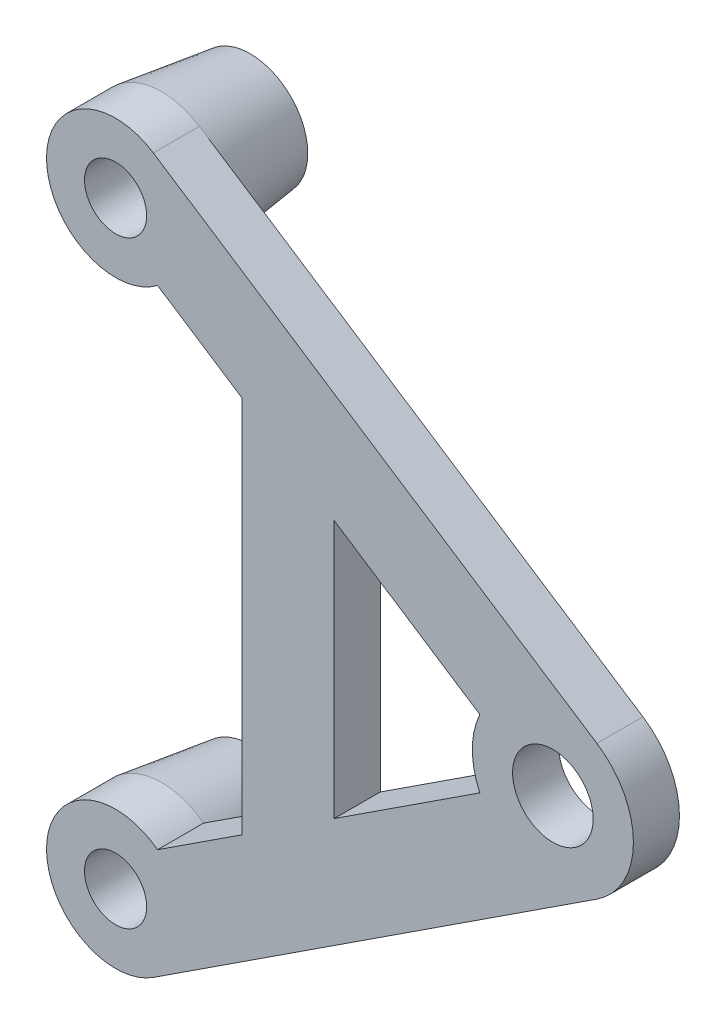
ISO-10303-21;
HEADER;
FILE_DESCRIPTION(('STEP AP214'),'2;1');
FILE_NAME('part.step','',(''),(''),'','','');
FILE_SCHEMA(('AUTOMOTIVE_DESIGN { 1 0 10303 214 1 1 1 1 }'));
ENDSEC;
DATA;
#1=APPLICATION_CONTEXT('core data for automotive mechanical design processes');
#2=APPLICATION_PROTOCOL_DEFINITION('international standard','automotive_design',2000,#1);
#3=PRODUCT_CONTEXT('',#1,'mechanical');
#4=PRODUCT('Part','Part','',(#3));
#5=PRODUCT_RELATED_PRODUCT_CATEGORY('part','',(#4));
#6=PRODUCT_DEFINITION_FORMATION('','',#4);
#7=PRODUCT_DEFINITION_CONTEXT('part definition',#1,'design');
#8=PRODUCT_DEFINITION('design','',#6,#7);
#9=PRODUCT_DEFINITION_SHAPE('','',#8);
#10=(LENGTH_UNIT() NAMED_UNIT(*) SI_UNIT(.MILLI.,.METRE.));
#11=(NAMED_UNIT(*) PLANE_ANGLE_UNIT() SI_UNIT($,.RADIAN.));
#12=(NAMED_UNIT(*) SI_UNIT($,.STERADIAN.) SOLID_ANGLE_UNIT());
#13=UNCERTAINTY_MEASURE_WITH_UNIT(LENGTH_MEASURE(1.E-05),#10,'distance_accuracy_value','');
#14=(GEOMETRIC_REPRESENTATION_CONTEXT(3) GLOBAL_UNCERTAINTY_ASSIGNED_CONTEXT((#13)) GLOBAL_UNIT_ASSIGNED_CONTEXT((#10,
#11,#12)) REPRESENTATION_CONTEXT('',''));
#15=CARTESIAN_POINT('',(0.,0.,0.));
#16=DIRECTION('',(0.,0.,1.));
#17=DIRECTION('',(1.,0.,0.));
#18=AXIS2_PLACEMENT_3D('',#15,#16,#17);
#19=CARTESIAN_POINT('',(0.,0.,0.));
#20=DIRECTION('',(0.,0.,1.));
#21=DIRECTION('',(1.,0.,0.));
#22=AXIS2_PLACEMENT_3D('',#19,#20,#21);
#23=PLANE('',#22);
#24=DIRECTION('',(0.837376741295073,-0.546626191412417,0.));
#25=VECTOR('',#24,1.);
#26=CARTESIAN_POINT('',(5.13057747821047,7.85953237726286,0.));
#27=LINE('',#26,#25);
#28=CARTESIAN_POINT('',(-15.3563342054036,21.2330618236347,7.01695646032618E-13));
#29=VERTEX_POINT('',#28);
#30=CARTESIAN_POINT('',(-8.,16.4309640925255,0.));
#31=VERTEX_POINT('',#30);
#32=EDGE_CURVE('E182',#29,#31,#27,.T.);
#33=ORIENTED_EDGE('',*,*,#32,.F.);
#34=CARTESIAN_POINT('',(-19.,26.,0.));
#35=DIRECTION('',(0.,0.,1.));
#36=DIRECTION('',(1.,0.,0.));
#37=AXIS2_PLACEMENT_3D('',#34,#35,#36);
#38=CIRCLE('',#37,6.);
#39=CARTESIAN_POINT('',(-15.7202428515256,31.0242604477705,0.));
#40=VERTEX_POINT('',#39);
#41=EDGE_CURVE('E41',#29,#40,#38,.T.);
#42=ORIENTED_EDGE('',*,*,#41,.T.);
#43=DIRECTION('',(0.837376741295073,-0.546626191412416,0.));
#44=VECTOR('',#43,1.);
#45=CARTESIAN_POINT('',(9.50358700950979,14.5585463076234,0.));
#46=LINE('',#45,#44);
#47=CARTESIAN_POINT('',(22.826383339887,5.86163718906552,0.));
#48=VERTEX_POINT('',#47);
#49=EDGE_CURVE('E228',#40,#48,#46,.T.);
#50=ORIENTED_EDGE('',*,*,#49,.T.);
#51=CARTESIAN_POINT('',(19.,0.,0.));
#52=DIRECTION('',(0.,0.,1.));
#53=DIRECTION('',(1.,0.,0.));
#54=AXIS2_PLACEMENT_3D('',#51,#52,#53);
#55=CIRCLE('',#54,7.00000000000007);
#56=CARTESIAN_POINT('',(22.826383339887,-5.86163718906551,0.));
#57=VERTEX_POINT('',#56);
#58=EDGE_CURVE('E225',#57,#48,#55,.T.);
#59=ORIENTED_EDGE('',*,*,#58,.F.);
#60=DIRECTION('',(0.837376741295073,0.546626191412416,0.));
#61=VECTOR('',#60,1.);
#62=CARTESIAN_POINT('',(9.50358700950978,-14.5585463076234,0.));
#63=LINE('',#62,#61);
#64=CARTESIAN_POINT('',(-15.7202428515255,-31.0242604477705,0.));
#65=VERTEX_POINT('',#64);
#66=EDGE_CURVE('E223',#65,#57,#63,.T.);
#67=ORIENTED_EDGE('',*,*,#66,.F.);
#68=CARTESIAN_POINT('',(-19.,-26.,0.));
#69=DIRECTION('',(0.,0.,1.));
#70=DIRECTION('',(1.,0.,0.));
#71=AXIS2_PLACEMENT_3D('',#68,#69,#70);
#72=CIRCLE('',#71,6.);
#73=CARTESIAN_POINT('',(-15.3563342054037,-21.2330618236347,0.));
#74=VERTEX_POINT('',#73);
#75=EDGE_CURVE('E11',#74,#65,#72,.F.);
#76=ORIENTED_EDGE('',*,*,#75,.F.);
#77=DIRECTION('',(-0.837376741295072,-0.546626191412418,0.));
#78=VECTOR('',#77,1.);
#79=CARTESIAN_POINT('',(5.13057747821048,-7.85953237726286,0.));
#80=LINE('',#79,#78);
#81=CARTESIAN_POINT('',(-7.99999999999999,-16.4309640925255,0.));
#82=VERTEX_POINT('',#81);
#83=EDGE_CURVE('E173',#82,#74,#80,.T.);
#84=ORIENTED_EDGE('',*,*,#83,.F.);
#85=DIRECTION('',(0.,-1.,0.));
#86=VECTOR('',#85,1.);
#87=CARTESIAN_POINT('',(-8.,0.,0.));
#88=LINE('',#87,#86);
#89=EDGE_CURVE('E184',#31,#82,#88,.T.);
#90=ORIENTED_EDGE('',*,*,#89,.F.);
#91=EDGE_LOOP('',(#33,#42,#50,#59,#67,#76,#84,#90));
#92=FACE_BOUND('',#91,.T.);
#93=CARTESIAN_POINT('',(19.,0.,0.));
#94=DIRECTION('',(0.,0.,1.));
#95=DIRECTION('',(1.,0.,0.));
#96=AXIS2_PLACEMENT_3D('',#93,#94,#95);
#97=CIRCLE('',#96,3.5);
#98=CARTESIAN_POINT('',(22.5,0.,0.));
#99=VERTEX_POINT('',#98);
#100=EDGE_CURVE('E202',#99,#99,#97,.T.);
#101=ORIENTED_EDGE('',*,*,#100,.T.);
#102=EDGE_LOOP('',(#101));
#103=FACE_BOUND('',#102,.T.);
#104=CARTESIAN_POINT('',(19.,0.,0.));
#105=DIRECTION('',(0.,0.,1.));
#106=DIRECTION('',(1.,0.,0.));
#107=AXIS2_PLACEMENT_3D('',#104,#105,#106);
#108=CIRCLE('',#107,7.00000000000007);
#109=CARTESIAN_POINT('',(12.6518575645895,2.94976060380174,0.));
#110=VERTEX_POINT('',#109);
#111=CARTESIAN_POINT('',(12.6518575645895,-2.94976060380173,0.));
#112=VERTEX_POINT('',#111);
#113=EDGE_CURVE('E158',#110,#112,#108,.T.);
#114=ORIENTED_EDGE('',*,*,#113,.F.);
#115=DIRECTION('',(0.837376741295073,-0.546626191412417,0.));
#116=VECTOR('',#115,1.);
#117=CARTESIAN_POINT('',(5.13057747821047,7.85953237726286,0.));
#118=LINE('',#117,#116);
#119=CARTESIAN_POINT('',(0.,11.2086915888301,0.));
#120=VERTEX_POINT('',#119);
#121=EDGE_CURVE('E151',#120,#110,#118,.T.);
#122=ORIENTED_EDGE('',*,*,#121,.F.);
#123=DIRECTION('',(0.,1.,0.));
#124=VECTOR('',#123,1.);
#125=CARTESIAN_POINT('',(0.,0.,0.));
#126=LINE('',#125,#124);
#127=CARTESIAN_POINT('',(0.,-11.2086915888301,0.));
#128=VERTEX_POINT('',#127);
#129=EDGE_CURVE('E132',#128,#120,#126,.T.);
#130=ORIENTED_EDGE('',*,*,#129,.F.);
#131=DIRECTION('',(-0.837376741295072,-0.546626191412418,0.));
#132=VECTOR('',#131,1.);
#133=CARTESIAN_POINT('',(5.13057747821048,-7.85953237726286,0.));
#134=LINE('',#133,#132);
#135=EDGE_CURVE('E156',#112,#128,#134,.T.);
#136=ORIENTED_EDGE('',*,*,#135,.F.);
#137=EDGE_LOOP('',(#114,#122,#130,#136));
#138=FACE_BOUND('',#137,.T.);
#139=ADVANCED_FACE('F37',(#92,#103,#138),#23,.F.);
#140=CARTESIAN_POINT('',(0.,0.,4.));
#141=DIRECTION('',(0.,0.,1.));
#142=DIRECTION('',(1.,0.,0.));
#143=AXIS2_PLACEMENT_3D('',#140,#141,#142);
#144=PLANE('',#143);
#145=DIRECTION('',(-0.837376741295073,-0.546626191412418,0.));
#146=VECTOR('',#145,1.);
#147=CARTESIAN_POINT('',(5.13057747821048,-7.85953237726286,4.));
#148=LINE('',#147,#146);
#149=CARTESIAN_POINT('',(-7.99999999999999,-16.4309640925255,4.));
#150=VERTEX_POINT('',#149);
#151=CARTESIAN_POINT('',(-15.3563342054036,-21.2330618236347,4.));
#152=VERTEX_POINT('',#151);
#153=EDGE_CURVE('E160',#150,#152,#148,.T.);
#154=ORIENTED_EDGE('',*,*,#153,.T.);
#155=CARTESIAN_POINT('',(-19.,-26.,4.));
#156=DIRECTION('',(0.,0.,1.));
#157=DIRECTION('',(1.,0.,0.));
#158=AXIS2_PLACEMENT_3D('',#155,#156,#157);
#159=CIRCLE('',#158,6.);
#160=CARTESIAN_POINT('',(-15.7202428515256,-31.0242604477705,4.));
#161=VERTEX_POINT('',#160);
#162=EDGE_CURVE('E199',#152,#161,#159,.T.);
#163=ORIENTED_EDGE('',*,*,#162,.T.);
#164=DIRECTION('',(0.837376741295073,0.546626191412416,0.));
#165=VECTOR('',#164,1.);
#166=CARTESIAN_POINT('',(9.50358700950978,-14.5585463076234,4.));
#167=LINE('',#166,#165);
#168=CARTESIAN_POINT('',(22.826383339887,-5.86163718906551,4.));
#169=VERTEX_POINT('',#168);
#170=EDGE_CURVE('E201',#161,#169,#167,.T.);
#171=ORIENTED_EDGE('',*,*,#170,.T.);
#172=CARTESIAN_POINT('',(19.,0.,4.));
#173=DIRECTION('',(0.,0.,1.));
#174=DIRECTION('',(1.,0.,0.));
#175=AXIS2_PLACEMENT_3D('',#172,#173,#174);
#176=CIRCLE('',#175,7.00000000000007);
#177=CARTESIAN_POINT('',(22.826383339887,5.86163718906552,4.));
#178=VERTEX_POINT('',#177);
#179=EDGE_CURVE('E204',#169,#178,#176,.T.);
#180=ORIENTED_EDGE('',*,*,#179,.T.);
#181=DIRECTION('',(0.837376741295073,-0.546626191412416,0.));
#182=VECTOR('',#181,1.);
#183=CARTESIAN_POINT('',(9.50358700950979,14.5585463076234,4.));
#184=LINE('',#183,#182);
#185=CARTESIAN_POINT('',(-15.7202428515256,31.0242604477705,4.));
#186=VERTEX_POINT('',#185);
#187=EDGE_CURVE('E206',#186,#178,#184,.T.);
#188=ORIENTED_EDGE('',*,*,#187,.F.);
#189=CARTESIAN_POINT('',(-19.,26.,4.));
#190=DIRECTION('',(0.,0.,1.));
#191=DIRECTION('',(1.,0.,0.));
#192=AXIS2_PLACEMENT_3D('',#189,#190,#191);
#193=CIRCLE('',#192,6.00000000000006);
#194=CARTESIAN_POINT('',(-15.3563342054036,21.2330618236347,4.));
#195=VERTEX_POINT('',#194);
#196=EDGE_CURVE('E209',#186,#195,#193,.T.);
#197=ORIENTED_EDGE('',*,*,#196,.T.);
#198=DIRECTION('',(0.837376741295073,-0.546626191412417,0.));
#199=VECTOR('',#198,1.);
#200=CARTESIAN_POINT('',(5.13057747821047,7.85953237726286,4.));
#201=LINE('',#200,#199);
#202=CARTESIAN_POINT('',(-8.,16.4309640925255,4.));
#203=VERTEX_POINT('',#202);
#204=EDGE_CURVE('E166',#195,#203,#201,.T.);
#205=ORIENTED_EDGE('',*,*,#204,.T.);
#206=DIRECTION('',(0.,-1.,0.));
#207=VECTOR('',#206,1.);
#208=CARTESIAN_POINT('',(-8.,0.,4.));
#209=LINE('',#208,#207);
#210=EDGE_CURVE('E163',#203,#150,#209,.T.);
#211=ORIENTED_EDGE('',*,*,#210,.T.);
#212=EDGE_LOOP('',(#154,#163,#171,#180,#188,#197,#205,#211));
#213=FACE_BOUND('',#212,.T.);
#214=CARTESIAN_POINT('',(19.,0.,4.));
#215=DIRECTION('',(0.,0.,1.));
#216=DIRECTION('',(1.,0.,0.));
#217=AXIS2_PLACEMENT_3D('',#214,#215,#216);
#218=CIRCLE('',#217,3.5);
#219=CARTESIAN_POINT('',(22.5,0.,4.));
#220=VERTEX_POINT('',#219);
#221=EDGE_CURVE('E211',#220,#220,#218,.T.);
#222=ORIENTED_EDGE('',*,*,#221,.F.);
#223=EDGE_LOOP('',(#222));
#224=FACE_BOUND('',#223,.T.);
#225=CARTESIAN_POINT('',(-19.,26.,4.));
#226=DIRECTION('',(0.,0.,1.));
#227=DIRECTION('',(1.,0.,0.));
#228=AXIS2_PLACEMENT_3D('',#225,#226,#227);
#229=CIRCLE('',#228,2.7);
#230=CARTESIAN_POINT('',(-16.3,26.,4.));
#231=VERTEX_POINT('',#230);
#232=EDGE_CURVE('E214',#231,#231,#229,.T.);
#233=ORIENTED_EDGE('',*,*,#232,.F.);
#234=EDGE_LOOP('',(#233));
#235=FACE_BOUND('',#234,.T.);
#236=CARTESIAN_POINT('',(-19.,-26.,4.));
#237=DIRECTION('',(0.,0.,1.));
#238=DIRECTION('',(1.,0.,0.));
#239=AXIS2_PLACEMENT_3D('',#236,#237,#238);
#240=CIRCLE('',#239,2.7);
#241=CARTESIAN_POINT('',(-16.3,-26.,4.));
#242=VERTEX_POINT('',#241);
#243=EDGE_CURVE('E217',#242,#242,#240,.T.);
#244=ORIENTED_EDGE('',*,*,#243,.F.);
#245=EDGE_LOOP('',(#244));
#246=FACE_BOUND('',#245,.T.);
#247=DIRECTION('',(0.837376741295073,-0.546626191412417,0.));
#248=VECTOR('',#247,1.);
#249=CARTESIAN_POINT('',(5.13057747821047,7.85953237726286,4.));
#250=LINE('',#249,#248);
#251=CARTESIAN_POINT('',(0.,11.2086915888301,4.));
#252=VERTEX_POINT('',#251);
#253=CARTESIAN_POINT('',(12.6518575645895,2.94976060380174,4.));
#254=VERTEX_POINT('',#253);
#255=EDGE_CURVE('E138',#252,#254,#250,.T.);
#256=ORIENTED_EDGE('',*,*,#255,.T.);
#257=CARTESIAN_POINT('',(19.,0.,4.));
#258=DIRECTION('',(0.,0.,1.));
#259=DIRECTION('',(1.,0.,0.));
#260=AXIS2_PLACEMENT_3D('',#257,#258,#259);
#261=CIRCLE('',#260,7.00000000000007);
#262=CARTESIAN_POINT('',(12.6518575645895,-2.94976060380173,4.));
#263=VERTEX_POINT('',#262);
#264=EDGE_CURVE('E61',#254,#263,#261,.T.);
#265=ORIENTED_EDGE('',*,*,#264,.T.);
#266=DIRECTION('',(-0.837376741295073,-0.546626191412418,0.));
#267=VECTOR('',#266,1.);
#268=CARTESIAN_POINT('',(5.13057747821048,-7.85953237726286,4.));
#269=LINE('',#268,#267);
#270=CARTESIAN_POINT('',(0.,-11.2086915888301,4.));
#271=VERTEX_POINT('',#270);
#272=EDGE_CURVE('E144',#263,#271,#269,.T.);
#273=ORIENTED_EDGE('',*,*,#272,.T.);
#274=DIRECTION('',(0.,1.,0.));
#275=VECTOR('',#274,1.);
#276=CARTESIAN_POINT('',(0.,0.,4.));
#277=LINE('',#276,#275);
#278=EDGE_CURVE('E129',#271,#252,#277,.T.);
#279=ORIENTED_EDGE('',*,*,#278,.T.);
#280=EDGE_LOOP('',(#256,#265,#273,#279));
#281=FACE_BOUND('',#280,.T.);
#282=ADVANCED_FACE('F142',(#213,#224,#235,#246,#281),#144,.T.);
#283=CARTESIAN_POINT('',(-19.,-26.,4.));
#284=DIRECTION('',(0.,0.,-1.));
#285=DIRECTION('',(-1.,0.,0.));
#286=AXIS2_PLACEMENT_3D('',#283,#284,#285);
#287=CYLINDRICAL_SURFACE('',#286,6.);
#288=CARTESIAN_POINT('',(-19.,-26.,0.));
#289=DIRECTION('',(0.,0.,1.));
#290=DIRECTION('',(1.,0.,0.));
#291=AXIS2_PLACEMENT_3D('',#288,#289,#290);
#292=CIRCLE('',#291,6.);
#293=EDGE_CURVE('E198',#74,#65,#292,.T.);
#294=ORIENTED_EDGE('',*,*,#293,.T.);
#295=DIRECTION('',(0.,0.,-1.));
#296=VECTOR('',#295,1.);
#297=CARTESIAN_POINT('',(-15.7202428515256,-31.0242604477705,4.));
#298=LINE('',#297,#296);
#299=EDGE_CURVE('E237',#161,#65,#298,.T.);
#300=ORIENTED_EDGE('',*,*,#299,.F.);
#301=ORIENTED_EDGE('',*,*,#162,.F.);
#302=DIRECTION('',(0.,0.,1.));
#303=VECTOR('',#302,1.);
#304=CARTESIAN_POINT('',(-15.3563342054036,-21.2330618236347,-7.70000000000004));
#305=LINE('',#304,#303);
#306=EDGE_CURVE('E169',#74,#152,#305,.T.);
#307=ORIENTED_EDGE('',*,*,#306,.F.);
#308=EDGE_LOOP('',(#294,#300,#301,#307));
#309=FACE_BOUND('',#308,.T.);
#310=ADVANCED_FACE('F39',(#309),#287,.T.);
#311=CARTESIAN_POINT('',(9.50358700950978,-14.5585463076234,4.));
#312=DIRECTION('',(-0.546626191412416,0.837376741295073,0.));
#313=DIRECTION('',(-0.837376741295073,-0.546626191412416,0.));
#314=AXIS2_PLACEMENT_3D('',#311,#312,#313);
#315=PLANE('',#314);
#316=ORIENTED_EDGE('',*,*,#66,.T.);
#317=DIRECTION('',(0.,0.,-1.));
#318=VECTOR('',#317,1.);
#319=CARTESIAN_POINT('',(22.826383339887,-5.86163718906551,4.));
#320=LINE('',#319,#318);
#321=EDGE_CURVE('E234',#169,#57,#320,.T.);
#322=ORIENTED_EDGE('',*,*,#321,.F.);
#323=ORIENTED_EDGE('',*,*,#170,.F.);
#324=ORIENTED_EDGE('',*,*,#299,.T.);
#325=EDGE_LOOP('',(#316,#322,#323,#324));
#326=FACE_BOUND('',#325,.T.);
#327=ADVANCED_FACE('F270',(#326),#315,.F.);
#328=CARTESIAN_POINT('',(19.,0.,4.));
#329=DIRECTION('',(0.,0.,-1.));
#330=DIRECTION('',(-1.,0.,0.));
#331=AXIS2_PLACEMENT_3D('',#328,#329,#330);
#332=CYLINDRICAL_SURFACE('',#331,7.00000000000007);
#333=ORIENTED_EDGE('',*,*,#58,.T.);
#334=DIRECTION('',(0.,0.,-1.));
#335=VECTOR('',#334,1.);
#336=CARTESIAN_POINT('',(22.826383339887,5.86163718906552,4.));
#337=LINE('',#336,#335);
#338=EDGE_CURVE('E232',#178,#48,#337,.T.);
#339=ORIENTED_EDGE('',*,*,#338,.F.);
#340=ORIENTED_EDGE('',*,*,#179,.F.);
#341=ORIENTED_EDGE('',*,*,#321,.T.);
#342=EDGE_LOOP('',(#333,#339,#340,#341));
#343=FACE_BOUND('',#342,.T.);
#344=ADVANCED_FACE('F266',(#343),#332,.T.);
#345=CARTESIAN_POINT('',(9.50358700950979,14.5585463076234,4.));
#346=DIRECTION('',(0.546626191412416,0.837376741295074,0.));
#347=DIRECTION('',(-0.837376741295073,0.546626191412416,0.));
#348=AXIS2_PLACEMENT_3D('',#345,#346,#347);
#349=PLANE('',#348);
#350=ORIENTED_EDGE('',*,*,#49,.F.);
#351=DIRECTION('',(0.,0.,-1.));
#352=VECTOR('',#351,1.);
#353=CARTESIAN_POINT('',(-15.7202428515256,31.0242604477705,4.));
#354=LINE('',#353,#352);
#355=EDGE_CURVE('E220',#186,#40,#354,.T.);
#356=ORIENTED_EDGE('',*,*,#355,.F.);
#357=ORIENTED_EDGE('',*,*,#187,.T.);
#358=ORIENTED_EDGE('',*,*,#338,.T.);
#359=EDGE_LOOP('',(#350,#356,#357,#358));
#360=FACE_BOUND('',#359,.T.);
#361=ADVANCED_FACE('F260',(#360),#349,.T.);
#362=CARTESIAN_POINT('',(-19.,26.,4.));
#363=DIRECTION('',(0.,0.,-1.));
#364=DIRECTION('',(-1.,0.,0.));
#365=AXIS2_PLACEMENT_3D('',#362,#363,#364);
#366=CYLINDRICAL_SURFACE('',#365,6.00000000000006);
#367=CARTESIAN_POINT('',(-19.,26.,0.));
#368=DIRECTION('',(0.,0.,1.));
#369=DIRECTION('',(1.,0.,0.));
#370=AXIS2_PLACEMENT_3D('',#367,#368,#369);
#371=CIRCLE('',#370,6.00000000000006);
#372=EDGE_CURVE('E231',#40,#29,#371,.T.);
#373=ORIENTED_EDGE('',*,*,#372,.T.);
#374=DIRECTION('',(0.,0.,1.));
#375=VECTOR('',#374,1.);
#376=CARTESIAN_POINT('',(-15.3563342054036,21.2330618236347,-7.70000000000004));
#377=LINE('',#376,#375);
#378=EDGE_CURVE('E170',#29,#195,#377,.T.);
#379=ORIENTED_EDGE('',*,*,#378,.T.);
#380=ORIENTED_EDGE('',*,*,#196,.F.);
#381=ORIENTED_EDGE('',*,*,#355,.T.);
#382=EDGE_LOOP('',(#373,#379,#380,#381));
#383=FACE_BOUND('',#382,.T.);
#384=ADVANCED_FACE('F294',(#383),#366,.T.);
#385=CARTESIAN_POINT('',(-19.,26.,4.));
#386=DIRECTION('',(0.,0.,-1.));
#387=DIRECTION('',(-1.,0.,0.));
#388=AXIS2_PLACEMENT_3D('',#385,#386,#387);
#389=CYLINDRICAL_SURFACE('',#388,2.7);
#390=ORIENTED_EDGE('',*,*,#232,.T.);
#391=EDGE_LOOP('',(#390));
#392=FACE_BOUND('',#391,.T.);
#393=CARTESIAN_POINT('',(-19.,26.,-7.70000000000004));
#394=DIRECTION('',(0.,0.,1.));
#395=DIRECTION('',(1.,0.,0.));
#396=AXIS2_PLACEMENT_3D('',#393,#394,#395);
#397=CIRCLE('',#396,2.7);
#398=CARTESIAN_POINT('',(-16.3,26.,-7.70000000000004));
#399=VERTEX_POINT('',#398);
#400=EDGE_CURVE('E195',#399,#399,#397,.T.);
#401=ORIENTED_EDGE('',*,*,#400,.F.);
#402=EDGE_LOOP('',(#401));
#403=FACE_BOUND('',#402,.T.);
#404=ADVANCED_FACE('F323',(#392,#403),#389,.F.);
#405=CARTESIAN_POINT('',(19.,0.,4.));
#406=DIRECTION('',(0.,0.,-1.));
#407=DIRECTION('',(-1.,0.,0.));
#408=AXIS2_PLACEMENT_3D('',#405,#406,#407);
#409=CYLINDRICAL_SURFACE('',#408,3.5);
#410=ORIENTED_EDGE('',*,*,#221,.T.);
#411=EDGE_LOOP('',(#410));
#412=FACE_BOUND('',#411,.T.);
#413=ORIENTED_EDGE('',*,*,#100,.F.);
#414=EDGE_LOOP('',(#413));
#415=FACE_BOUND('',#414,.T.);
#416=ADVANCED_FACE('F321',(#412,#415),#409,.F.);
#417=CARTESIAN_POINT('',(-19.,-26.,4.));
#418=DIRECTION('',(0.,0.,-1.));
#419=DIRECTION('',(-1.,0.,0.));
#420=AXIS2_PLACEMENT_3D('',#417,#418,#419);
#421=CYLINDRICAL_SURFACE('',#420,2.7);
#422=ORIENTED_EDGE('',*,*,#243,.T.);
#423=EDGE_LOOP('',(#422));
#424=FACE_BOUND('',#423,.T.);
#425=CARTESIAN_POINT('',(-19.,-26.,-7.70000000000004));
#426=DIRECTION('',(0.,0.,-1.));
#427=DIRECTION('',(1.,0.,0.));
#428=AXIS2_PLACEMENT_3D('',#425,#426,#427);
#429=CIRCLE('',#428,2.7);
#430=CARTESIAN_POINT('',(-16.3,-26.,-7.70000000000004));
#431=VERTEX_POINT('',#430);
#432=EDGE_CURVE('E189',#431,#431,#429,.T.);
#433=ORIENTED_EDGE('',*,*,#432,.T.);
#434=EDGE_LOOP('',(#433));
#435=FACE_BOUND('',#434,.T.);
#436=ADVANCED_FACE('F317',(#424,#435),#421,.F.);
#437=CARTESIAN_POINT('',(-17.5241092831865,28.2609172014967,-7.70000000000002));
#438=DIRECTION('',(0.,0.,1.));
#439=DIRECTION('',(1.,0.,0.));
#440=AXIS2_PLACEMENT_3D('',#437,#438,#439);
#441=PLANE('',#440);
#442=CARTESIAN_POINT('',(-19.,26.,-7.70000000000004));
#443=DIRECTION('',(0.,0.,1.));
#444=DIRECTION('',(1.,0.,0.));
#445=AXIS2_PLACEMENT_3D('',#442,#443,#444);
#446=CIRCLE('',#445,5.);
#447=CARTESIAN_POINT('',(-14.,26.,-7.70000000000004));
#448=VERTEX_POINT('',#447);
#449=EDGE_CURVE('E192',#448,#448,#446,.T.);
#450=ORIENTED_EDGE('',*,*,#449,.F.);
#451=EDGE_LOOP('',(#450));
#452=FACE_BOUND('',#451,.T.);
#453=ORIENTED_EDGE('',*,*,#400,.T.);
#454=EDGE_LOOP('',(#453));
#455=FACE_BOUND('',#454,.T.);
#456=ADVANCED_FACE('F320',(#452,#455),#441,.F.);
#457=CARTESIAN_POINT('',(-19.,26.,-7.70000000000004));
#458=DIRECTION('',(0.,0.,1.));
#459=DIRECTION('',(1.,0.,0.));
#460=AXIS2_PLACEMENT_3D('',#457,#458,#459);
#461=CONICAL_SURFACE('',#460,5.,0.12914729012802);
#462=ORIENTED_EDGE('',*,*,#372,.F.);
#463=ORIENTED_EDGE('',*,*,#41,.F.);
#464=EDGE_LOOP('',(#462,#463));
#465=FACE_BOUND('',#464,.T.);
#466=ORIENTED_EDGE('',*,*,#449,.T.);
#467=EDGE_LOOP('',(#466));
#468=FACE_BOUND('',#467,.T.);
#469=ADVANCED_FACE('F291',(#465,#468),#461,.T.);
#470=CARTESIAN_POINT('',(-17.5241092831865,-28.2609172014967,-7.70000000000002));
#471=DIRECTION('',(0.,0.,1.));
#472=DIRECTION('',(1.,0.,0.));
#473=AXIS2_PLACEMENT_3D('',#470,#471,#472);
#474=PLANE('',#473);
#475=CARTESIAN_POINT('',(-19.,-26.,-7.70000000000004));
#476=DIRECTION('',(0.,0.,-1.));
#477=DIRECTION('',(1.,0.,0.));
#478=AXIS2_PLACEMENT_3D('',#475,#476,#477);
#479=CIRCLE('',#478,5.);
#480=CARTESIAN_POINT('',(-14.,-26.,-7.70000000000004));
#481=VERTEX_POINT('',#480);
#482=EDGE_CURVE('E186',#481,#481,#479,.T.);
#483=ORIENTED_EDGE('',*,*,#482,.T.);
#484=EDGE_LOOP('',(#483));
#485=FACE_BOUND('',#484,.T.);
#486=ORIENTED_EDGE('',*,*,#432,.F.);
#487=EDGE_LOOP('',(#486));
#488=FACE_BOUND('',#487,.T.);
#489=ADVANCED_FACE('F358',(#485,#488),#474,.F.);
#490=CARTESIAN_POINT('',(-19.,-26.,-7.70000000000004));
#491=DIRECTION('',(0.,0.,1.));
#492=DIRECTION('',(1.,0.,0.));
#493=AXIS2_PLACEMENT_3D('',#490,#491,#492);
#494=CONICAL_SURFACE('',#493,5.,0.12914729012802);
#495=ORIENTED_EDGE('',*,*,#293,.F.);
#496=ORIENTED_EDGE('',*,*,#75,.T.);
#497=EDGE_LOOP('',(#495,#496));
#498=FACE_BOUND('',#497,.T.);
#499=ORIENTED_EDGE('',*,*,#482,.F.);
#500=EDGE_LOOP('',(#499));
#501=FACE_BOUND('',#500,.T.);
#502=ADVANCED_FACE('F276',(#498,#501),#494,.T.);
#503=CARTESIAN_POINT('',(-8.,0.,-7.70000000000004));
#504=DIRECTION('',(-1.,0.,0.));
#505=DIRECTION('',(0.,-1.,0.));
#506=AXIS2_PLACEMENT_3D('',#503,#504,#505);
#507=PLANE('',#506);
#508=ORIENTED_EDGE('',*,*,#89,.T.);
#509=DIRECTION('',(0.,0.,1.));
#510=VECTOR('',#509,1.);
#511=CARTESIAN_POINT('',(-7.99999999999999,-16.4309640925255,-7.70000000000004));
#512=LINE('',#511,#510);
#513=EDGE_CURVE('E176',#82,#150,#512,.T.);
#514=ORIENTED_EDGE('',*,*,#513,.T.);
#515=ORIENTED_EDGE('',*,*,#210,.F.);
#516=DIRECTION('',(0.,0.,1.));
#517=VECTOR('',#516,1.);
#518=CARTESIAN_POINT('',(-8.,16.4309640925255,-7.70000000000004));
#519=LINE('',#518,#517);
#520=EDGE_CURVE('E174',#31,#203,#519,.T.);
#521=ORIENTED_EDGE('',*,*,#520,.F.);
#522=EDGE_LOOP('',(#508,#514,#515,#521));
#523=FACE_BOUND('',#522,.T.);
#524=ADVANCED_FACE('F286',(#523),#507,.T.);
#525=CARTESIAN_POINT('',(5.13057747821047,7.85953237726286,-7.70000000000004));
#526=DIRECTION('',(-0.546626191412417,-0.837376741295073,0.));
#527=DIRECTION('',(0.837376741295073,-0.546626191412417,0.));
#528=AXIS2_PLACEMENT_3D('',#525,#526,#527);
#529=PLANE('',#528);
#530=ORIENTED_EDGE('',*,*,#32,.T.);
#531=ORIENTED_EDGE('',*,*,#520,.T.);
#532=ORIENTED_EDGE('',*,*,#204,.F.);
#533=ORIENTED_EDGE('',*,*,#378,.F.);
#534=EDGE_LOOP('',(#530,#531,#532,#533));
#535=FACE_BOUND('',#534,.T.);
#536=ADVANCED_FACE('F298',(#535),#529,.T.);
#537=CARTESIAN_POINT('',(5.13057747821048,-7.85953237726286,-7.70000000000004));
#538=DIRECTION('',(-0.546626191412418,0.837376741295072,0.));
#539=DIRECTION('',(-0.837376741295072,-0.546626191412418,0.));
#540=AXIS2_PLACEMENT_3D('',#537,#538,#539);
#541=PLANE('',#540);
#542=ORIENTED_EDGE('',*,*,#83,.T.);
#543=ORIENTED_EDGE('',*,*,#306,.T.);
#544=ORIENTED_EDGE('',*,*,#153,.F.);
#545=ORIENTED_EDGE('',*,*,#513,.F.);
#546=EDGE_LOOP('',(#542,#543,#544,#545));
#547=FACE_BOUND('',#546,.T.);
#548=ADVANCED_FACE('F283',(#547),#541,.T.);
#549=CARTESIAN_POINT('',(19.,0.,-7.70000000000004));
#550=DIRECTION('',(0.,0.,1.));
#551=DIRECTION('',(1.,0.,0.));
#552=AXIS2_PLACEMENT_3D('',#549,#550,#551);
#553=CYLINDRICAL_SURFACE('',#552,7.00000000000007);
#554=ORIENTED_EDGE('',*,*,#113,.T.);
#555=DIRECTION('',(0.,0.,1.));
#556=VECTOR('',#555,1.);
#557=CARTESIAN_POINT('',(12.6518575645895,-2.94976060380173,-7.70000000000004));
#558=LINE('',#557,#556);
#559=EDGE_CURVE('E149',#112,#263,#558,.T.);
#560=ORIENTED_EDGE('',*,*,#559,.T.);
#561=ORIENTED_EDGE('',*,*,#264,.F.);
#562=DIRECTION('',(0.,0.,1.));
#563=VECTOR('',#562,1.);
#564=CARTESIAN_POINT('',(12.6518575645895,2.94976060380174,-7.70000000000004));
#565=LINE('',#564,#563);
#566=EDGE_CURVE('E135',#110,#254,#565,.T.);
#567=ORIENTED_EDGE('',*,*,#566,.F.);
#568=EDGE_LOOP('',(#554,#560,#561,#567));
#569=FACE_BOUND('',#568,.T.);
#570=ADVANCED_FACE('F305',(#569),#553,.T.);
#571=CARTESIAN_POINT('',(5.13057747821048,-7.85953237726286,-7.70000000000004));
#572=DIRECTION('',(-0.546626191412418,0.837376741295072,0.));
#573=DIRECTION('',(-0.837376741295072,-0.546626191412418,0.));
#574=AXIS2_PLACEMENT_3D('',#571,#572,#573);
#575=PLANE('',#574);
#576=ORIENTED_EDGE('',*,*,#135,.T.);
#577=DIRECTION('',(0.,0.,1.));
#578=VECTOR('',#577,1.);
#579=CARTESIAN_POINT('',(0.,-11.2086915888301,-7.70000000000004));
#580=LINE('',#579,#578);
#581=EDGE_CURVE('E134',#128,#271,#580,.T.);
#582=ORIENTED_EDGE('',*,*,#581,.T.);
#583=ORIENTED_EDGE('',*,*,#272,.F.);
#584=ORIENTED_EDGE('',*,*,#559,.F.);
#585=EDGE_LOOP('',(#576,#582,#583,#584));
#586=FACE_BOUND('',#585,.T.);
#587=ADVANCED_FACE('F449',(#586),#575,.T.);
#588=CARTESIAN_POINT('',(0.,0.,-7.70000000000004));
#589=DIRECTION('',(1.,0.,0.));
#590=DIRECTION('',(0.,0.,-1.));
#591=AXIS2_PLACEMENT_3D('',#588,#589,#590);
#592=PLANE('',#591);
#593=ORIENTED_EDGE('',*,*,#129,.T.);
#594=DIRECTION('',(0.,0.,1.));
#595=VECTOR('',#594,1.);
#596=CARTESIAN_POINT('',(0.,11.2086915888301,-7.70000000000004));
#597=LINE('',#596,#595);
#598=EDGE_CURVE('E53',#120,#252,#597,.T.);
#599=ORIENTED_EDGE('',*,*,#598,.T.);
#600=ORIENTED_EDGE('',*,*,#278,.F.);
#601=ORIENTED_EDGE('',*,*,#581,.F.);
#602=EDGE_LOOP('',(#593,#599,#600,#601));
#603=FACE_BOUND('',#602,.T.);
#604=ADVANCED_FACE('F126',(#603),#592,.T.);
#605=CARTESIAN_POINT('',(5.13057747821047,7.85953237726286,-7.70000000000004));
#606=DIRECTION('',(-0.546626191412417,-0.837376741295073,0.));
#607=DIRECTION('',(0.837376741295073,-0.546626191412417,0.));
#608=AXIS2_PLACEMENT_3D('',#605,#606,#607);
#609=PLANE('',#608);
#610=ORIENTED_EDGE('',*,*,#121,.T.);
#611=ORIENTED_EDGE('',*,*,#566,.T.);
#612=ORIENTED_EDGE('',*,*,#255,.F.);
#613=ORIENTED_EDGE('',*,*,#598,.F.);
#614=EDGE_LOOP('',(#610,#611,#612,#613));
#615=FACE_BOUND('',#614,.T.);
#616=ADVANCED_FACE('F139',(#615),#609,.T.);
#617=CLOSED_SHELL('',(#139,#282,#310,#327,#344,#361,#384,#404,#416,#436,#456,#469,#489,#502,
#524,#536,#548,#570,#587,#604,#616));
#618=MANIFOLD_SOLID_BREP('B2',#617);
#619=ADVANCED_BREP_SHAPE_REPRESENTATION('',(#18,#618),#14);
#620=SHAPE_DEFINITION_REPRESENTATION(#9,#619);
ENDSEC;
END-ISO-10303-21;
